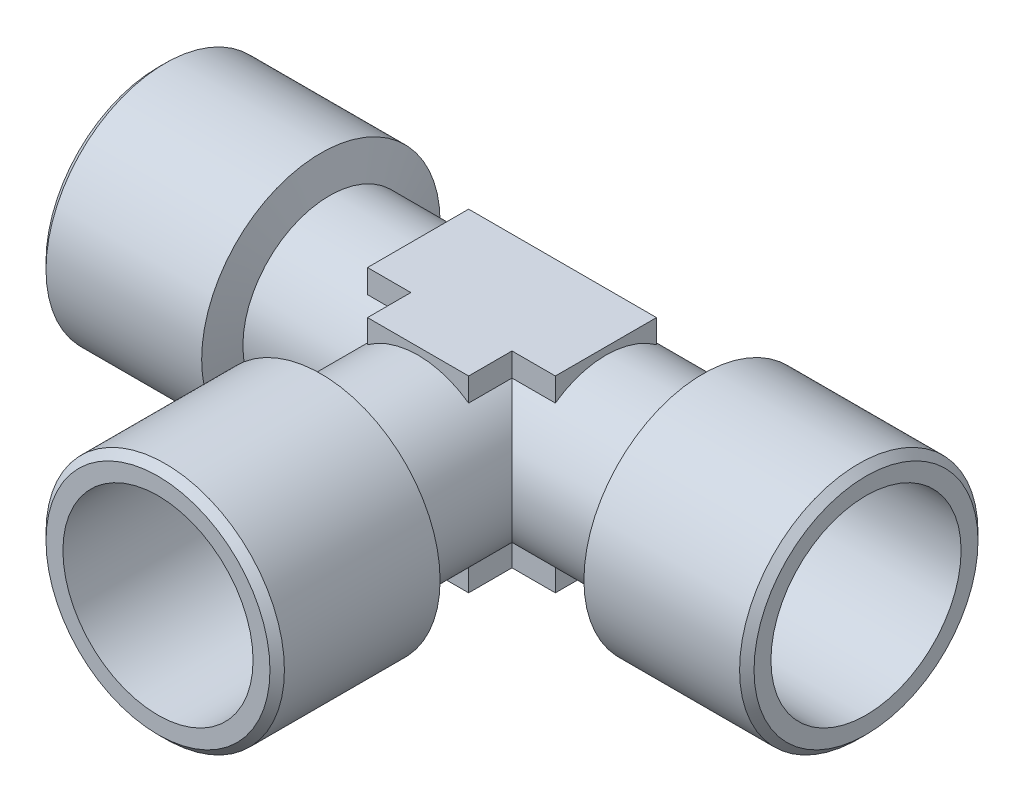
ISO-10303-21;
HEADER;
FILE_DESCRIPTION(('STEP AP214'),'2;1');
FILE_NAME('part.step','',(''),(''),'','','');
FILE_SCHEMA(('AUTOMOTIVE_DESIGN { 1 0 10303 214 1 1 1 1 }'));
ENDSEC;
DATA;
#1=APPLICATION_CONTEXT('core data for automotive mechanical design processes');
#2=APPLICATION_PROTOCOL_DEFINITION('international standard','automotive_design',2000,#1);
#3=PRODUCT_CONTEXT('',#1,'mechanical');
#4=PRODUCT('Part','Part','',(#3));
#5=PRODUCT_RELATED_PRODUCT_CATEGORY('part','',(#4));
#6=PRODUCT_DEFINITION_FORMATION('','',#4);
#7=PRODUCT_DEFINITION_CONTEXT('part definition',#1,'design');
#8=PRODUCT_DEFINITION('design','',#6,#7);
#9=PRODUCT_DEFINITION_SHAPE('','',#8);
#10=(LENGTH_UNIT() NAMED_UNIT(*) SI_UNIT(.MILLI.,.METRE.));
#11=(NAMED_UNIT(*) PLANE_ANGLE_UNIT() SI_UNIT($,.RADIAN.));
#12=(NAMED_UNIT(*) SI_UNIT($,.STERADIAN.) SOLID_ANGLE_UNIT());
#13=UNCERTAINTY_MEASURE_WITH_UNIT(LENGTH_MEASURE(1.E-05),#10,'distance_accuracy_value','');
#14=(GEOMETRIC_REPRESENTATION_CONTEXT(3) GLOBAL_UNCERTAINTY_ASSIGNED_CONTEXT((#13)) GLOBAL_UNIT_ASSIGNED_CONTEXT((#10,
#11,#12)) REPRESENTATION_CONTEXT('',''));
#15=CARTESIAN_POINT('',(0.,0.,0.));
#16=DIRECTION('',(0.,0.,1.));
#17=DIRECTION('',(1.,0.,0.));
#18=AXIS2_PLACEMENT_3D('',#15,#16,#17);
#19=CARTESIAN_POINT('',(0.,0.,0.));
#20=DIRECTION('',(-1.,0.,0.));
#21=DIRECTION('',(0.,0.,1.));
#22=AXIS2_PLACEMENT_3D('',#19,#20,#21);
#23=CYLINDRICAL_SURFACE('',#22,6.);
#24=CARTESIAN_POINT('',(-12.625,0.,0.));
#25=DIRECTION('',(-1.,0.,0.));
#26=DIRECTION('',(0.,0.,1.));
#27=AXIS2_PLACEMENT_3D('',#24,#25,#26);
#28=CIRCLE('',#27,6.);
#29=CARTESIAN_POINT('',(-12.625,0.,6.));
#30=VERTEX_POINT('',#29);
#31=EDGE_CURVE('E255',#30,#30,#28,.T.);
#32=ORIENTED_EDGE('',*,*,#31,.F.);
#33=EDGE_LOOP('',(#32));
#34=FACE_BOUND('',#33,.T.);
#35=CARTESIAN_POINT('',(12.625,0.,0.));
#36=DIRECTION('',(-1.,0.,0.));
#37=DIRECTION('',(0.,0.,1.));
#38=AXIS2_PLACEMENT_3D('',#35,#36,#37);
#39=CIRCLE('',#38,6.);
#40=CARTESIAN_POINT('',(12.625,0.,6.));
#41=VERTEX_POINT('',#40);
#42=EDGE_CURVE('E258',#41,#41,#39,.T.);
#43=ORIENTED_EDGE('',*,*,#42,.T.);
#44=EDGE_LOOP('',(#43));
#45=FACE_BOUND('',#44,.T.);
#46=DIRECTION('',(-1.,0.,0.));
#47=VECTOR('',#46,1.);
#48=CARTESIAN_POINT('',(0.,-4.87339717240448,3.5));
#49=LINE('',#48,#47);
#50=CARTESIAN_POINT('',(-3.5,-4.87339717240448,3.5));
#51=VERTEX_POINT('',#50);
#52=CARTESIAN_POINT('',(-6.5,-4.87339717240448,3.5));
#53=VERTEX_POINT('',#52);
#54=EDGE_CURVE('E241',#51,#53,#49,.T.);
#55=ORIENTED_EDGE('',*,*,#54,.F.);
#56=CARTESIAN_POINT('',(0.,0.,0.));
#57=DIRECTION('',(-0.707106781186547,0.,-0.707106781186547));
#58=DIRECTION('',(-0.707106781186547,0.,0.707106781186547));
#59=AXIS2_PLACEMENT_3D('',#56,#57,#58);
#60=ELLIPSE('',#59,8.48528137423857,6.);
#61=CARTESIAN_POINT('',(-3.5,4.87339717240448,3.5));
#62=VERTEX_POINT('',#61);
#63=EDGE_CURVE('E282',#51,#62,#60,.T.);
#64=ORIENTED_EDGE('',*,*,#63,.T.);
#65=DIRECTION('',(-1.,0.,0.));
#66=VECTOR('',#65,1.);
#67=CARTESIAN_POINT('',(0.,4.87339717240448,3.5));
#68=LINE('',#67,#66);
#69=CARTESIAN_POINT('',(-6.5,4.87339717240448,3.5));
#70=VERTEX_POINT('',#69);
#71=EDGE_CURVE('E239',#70,#62,#68,.F.);
#72=ORIENTED_EDGE('',*,*,#71,.F.);
#73=CARTESIAN_POINT('',(-6.5,0.,0.));
#74=DIRECTION('',(1.,0.,0.));
#75=DIRECTION('',(0.,0.,-1.));
#76=AXIS2_PLACEMENT_3D('',#73,#74,#75);
#77=CIRCLE('',#76,6.);
#78=CARTESIAN_POINT('',(-6.5,4.87339717240448,-3.5));
#79=VERTEX_POINT('',#78);
#80=EDGE_CURVE('E306',#79,#70,#77,.T.);
#81=ORIENTED_EDGE('',*,*,#80,.F.);
#82=DIRECTION('',(-1.,0.,0.));
#83=VECTOR('',#82,1.);
#84=CARTESIAN_POINT('',(0.,4.87339717240448,-3.5));
#85=LINE('',#84,#83);
#86=CARTESIAN_POINT('',(6.5,4.87339717240448,-3.5));
#87=VERTEX_POINT('',#86);
#88=EDGE_CURVE('E303',#87,#79,#85,.T.);
#89=ORIENTED_EDGE('',*,*,#88,.F.);
#90=CARTESIAN_POINT('',(6.5,0.,0.));
#91=DIRECTION('',(-1.,0.,0.));
#92=DIRECTION('',(0.,0.,1.));
#93=AXIS2_PLACEMENT_3D('',#90,#91,#92);
#94=CIRCLE('',#93,6.);
#95=CARTESIAN_POINT('',(6.5,4.87339717240448,3.5));
#96=VERTEX_POINT('',#95);
#97=EDGE_CURVE('E301',#96,#87,#94,.T.);
#98=ORIENTED_EDGE('',*,*,#97,.F.);
#99=DIRECTION('',(-1.,0.,0.));
#100=VECTOR('',#99,1.);
#101=CARTESIAN_POINT('',(0.,4.87339717240448,3.5));
#102=LINE('',#101,#100);
#103=CARTESIAN_POINT('',(3.5,4.87339717240448,3.5));
#104=VERTEX_POINT('',#103);
#105=EDGE_CURVE('E234',#104,#96,#102,.F.);
#106=ORIENTED_EDGE('',*,*,#105,.F.);
#107=CARTESIAN_POINT('',(0.,0.,0.));
#108=DIRECTION('',(-0.707106781186547,0.,0.707106781186547));
#109=DIRECTION('',(-0.707106781186547,0.,-0.707106781186547));
#110=AXIS2_PLACEMENT_3D('',#107,#108,#109);
#111=ELLIPSE('',#110,8.48528137423857,6.);
#112=CARTESIAN_POINT('',(3.5,-4.87339717240448,3.5));
#113=VERTEX_POINT('',#112);
#114=EDGE_CURVE('E279',#104,#113,#111,.F.);
#115=ORIENTED_EDGE('',*,*,#114,.T.);
#116=DIRECTION('',(-1.,0.,0.));
#117=VECTOR('',#116,1.);
#118=CARTESIAN_POINT('',(0.,-4.87339717240448,3.5));
#119=LINE('',#118,#117);
#120=CARTESIAN_POINT('',(6.5,-4.87339717240448,3.5));
#121=VERTEX_POINT('',#120);
#122=EDGE_CURVE('E236',#121,#113,#119,.T.);
#123=ORIENTED_EDGE('',*,*,#122,.F.);
#124=CARTESIAN_POINT('',(6.5,-4.87339717240448,-3.5));
#125=VERTEX_POINT('',#124);
#126=EDGE_CURVE('E304',#125,#121,#94,.T.);
#127=ORIENTED_EDGE('',*,*,#126,.F.);
#128=DIRECTION('',(-1.,0.,0.));
#129=VECTOR('',#128,1.);
#130=CARTESIAN_POINT('',(0.,-4.87339717240448,-3.5));
#131=LINE('',#130,#129);
#132=CARTESIAN_POINT('',(-6.5,-4.87339717240448,-3.5));
#133=VERTEX_POINT('',#132);
#134=EDGE_CURVE('E308',#133,#125,#131,.F.);
#135=ORIENTED_EDGE('',*,*,#134,.F.);
#136=EDGE_CURVE('E134',#53,#133,#77,.T.);
#137=ORIENTED_EDGE('',*,*,#136,.F.);
#138=EDGE_LOOP('',(#55,#64,#72,#81,#89,#98,#106,#115,#123,#127,#135,#137));
#139=FACE_BOUND('',#138,.T.);
#140=ADVANCED_FACE('F16',(#34,#45,#139),#23,.T.);
#141=CARTESIAN_POINT('',(0.,0.,0.));
#142=DIRECTION('',(0.,0.,-1.));
#143=DIRECTION('',(-1.,0.,0.));
#144=AXIS2_PLACEMENT_3D('',#141,#142,#143);
#145=CYLINDRICAL_SURFACE('',#144,6.);
#146=CARTESIAN_POINT('',(0.,0.,12.625));
#147=DIRECTION('',(0.,0.,-1.));
#148=DIRECTION('',(-1.,0.,0.));
#149=AXIS2_PLACEMENT_3D('',#146,#147,#148);
#150=CIRCLE('',#149,6.);
#151=CARTESIAN_POINT('',(-6.,0.,12.625));
#152=VERTEX_POINT('',#151);
#153=EDGE_CURVE('E252',#152,#152,#150,.T.);
#154=ORIENTED_EDGE('',*,*,#153,.T.);
#155=EDGE_LOOP('',(#154));
#156=FACE_BOUND('',#155,.T.);
#157=CARTESIAN_POINT('',(0.,0.,6.5));
#158=DIRECTION('',(0.,0.,-1.));
#159=DIRECTION('',(-1.,0.,0.));
#160=AXIS2_PLACEMENT_3D('',#157,#158,#159);
#161=CIRCLE('',#160,6.);
#162=CARTESIAN_POINT('',(3.5,4.87339717240448,6.5));
#163=VERTEX_POINT('',#162);
#164=CARTESIAN_POINT('',(-3.5,4.87339717240448,6.5));
#165=VERTEX_POINT('',#164);
#166=EDGE_CURVE('E292',#163,#165,#161,.F.);
#167=ORIENTED_EDGE('',*,*,#166,.T.);
#168=DIRECTION('',(0.,0.,-1.));
#169=VECTOR('',#168,1.);
#170=CARTESIAN_POINT('',(-3.5,4.87339717240448,0.));
#171=LINE('',#170,#169);
#172=EDGE_CURVE('E298',#165,#62,#171,.T.);
#173=ORIENTED_EDGE('',*,*,#172,.T.);
#174=ORIENTED_EDGE('',*,*,#63,.F.);
#175=DIRECTION('',(0.,0.,-1.));
#176=VECTOR('',#175,1.);
#177=CARTESIAN_POINT('',(-3.5,-4.87339717240448,0.));
#178=LINE('',#177,#176);
#179=CARTESIAN_POINT('',(-3.5,-4.87339717240448,6.5));
#180=VERTEX_POINT('',#179);
#181=EDGE_CURVE('E291',#51,#180,#178,.F.);
#182=ORIENTED_EDGE('',*,*,#181,.T.);
#183=CARTESIAN_POINT('',(3.5,-4.87339717240448,6.5));
#184=VERTEX_POINT('',#183);
#185=EDGE_CURVE('E288',#180,#184,#161,.F.);
#186=ORIENTED_EDGE('',*,*,#185,.T.);
#187=DIRECTION('',(0.,0.,-1.));
#188=VECTOR('',#187,1.);
#189=CARTESIAN_POINT('',(3.5,-4.87339717240448,0.));
#190=LINE('',#189,#188);
#191=EDGE_CURVE('E285',#184,#113,#190,.T.);
#192=ORIENTED_EDGE('',*,*,#191,.T.);
#193=ORIENTED_EDGE('',*,*,#114,.F.);
#194=DIRECTION('',(0.,0.,-1.));
#195=VECTOR('',#194,1.);
#196=CARTESIAN_POINT('',(3.5,4.87339717240448,0.));
#197=LINE('',#196,#195);
#198=EDGE_CURVE('E295',#104,#163,#197,.F.);
#199=ORIENTED_EDGE('',*,*,#198,.T.);
#200=EDGE_LOOP('',(#167,#173,#174,#182,#186,#192,#193,#199));
#201=FACE_BOUND('',#200,.T.);
#202=ADVANCED_FACE('F329',(#156,#201),#145,.T.);
#203=CARTESIAN_POINT('',(-12.625,0.,0.));
#204=DIRECTION('',(-1.,0.,0.));
#205=DIRECTION('',(0.,0.,1.));
#206=AXIS2_PLACEMENT_3D('',#203,#204,#205);
#207=CONICAL_SURFACE('',#206,6.,1.30899693899575);
#208=CARTESIAN_POINT('',(-13.22788568297,0.,0.));
#209=DIRECTION('',(-1.,0.,0.));
#210=DIRECTION('',(0.,0.,1.));
#211=AXIS2_PLACEMENT_3D('',#208,#209,#210);
#212=CIRCLE('',#211,8.25);
#213=CARTESIAN_POINT('',(-13.22788568297,0.,8.25));
#214=VERTEX_POINT('',#213);
#215=EDGE_CURVE('E276',#214,#214,#212,.T.);
#216=ORIENTED_EDGE('',*,*,#215,.F.);
#217=EDGE_LOOP('',(#216));
#218=FACE_BOUND('',#217,.T.);
#219=ORIENTED_EDGE('',*,*,#31,.T.);
#220=EDGE_LOOP('',(#219));
#221=FACE_BOUND('',#220,.T.);
#222=ADVANCED_FACE('F18',(#218,#221),#207,.T.);
#223=CARTESIAN_POINT('',(0.,0.,0.));
#224=DIRECTION('',(-1.,0.,0.));
#225=DIRECTION('',(0.,0.,1.));
#226=AXIS2_PLACEMENT_3D('',#223,#224,#225);
#227=CYLINDRICAL_SURFACE('',#226,8.25);
#228=CARTESIAN_POINT('',(-24.,0.,0.));
#229=DIRECTION('',(-1.,0.,0.));
#230=DIRECTION('',(0.,0.,1.));
#231=AXIS2_PLACEMENT_3D('',#228,#229,#230);
#232=CIRCLE('',#231,8.25);
#233=CARTESIAN_POINT('',(-24.,0.,8.25));
#234=VERTEX_POINT('',#233);
#235=EDGE_CURVE('E273',#234,#234,#232,.T.);
#236=ORIENTED_EDGE('',*,*,#235,.F.);
#237=EDGE_LOOP('',(#236));
#238=FACE_BOUND('',#237,.T.);
#239=ORIENTED_EDGE('',*,*,#215,.T.);
#240=EDGE_LOOP('',(#239));
#241=FACE_BOUND('',#240,.T.);
#242=ADVANCED_FACE('F432',(#238,#241),#227,.T.);
#243=CARTESIAN_POINT('',(-24.,0.,0.));
#244=DIRECTION('',(1.,0.,0.));
#245=DIRECTION('',(0.,0.,-1.));
#246=AXIS2_PLACEMENT_3D('',#243,#244,#245);
#247=CONICAL_SURFACE('',#246,8.25,0.785398163397445);
#248=CARTESIAN_POINT('',(-24.5,0.,0.));
#249=DIRECTION('',(-1.,0.,0.));
#250=DIRECTION('',(0.,0.,1.));
#251=AXIS2_PLACEMENT_3D('',#248,#249,#250);
#252=CIRCLE('',#251,7.75);
#253=CARTESIAN_POINT('',(-24.5,0.,7.75));
#254=VERTEX_POINT('',#253);
#255=EDGE_CURVE('E270',#254,#254,#252,.T.);
#256=ORIENTED_EDGE('',*,*,#255,.F.);
#257=EDGE_LOOP('',(#256));
#258=FACE_BOUND('',#257,.T.);
#259=ORIENTED_EDGE('',*,*,#235,.T.);
#260=EDGE_LOOP('',(#259));
#261=FACE_BOUND('',#260,.T.);
#262=ADVANCED_FACE('F429',(#258,#261),#247,.T.);
#263=CARTESIAN_POINT('',(-24.5,0.,-7.75));
#264=DIRECTION('',(1.,0.,0.));
#265=DIRECTION('',(0.,0.,-1.));
#266=AXIS2_PLACEMENT_3D('',#263,#264,#265);
#267=PLANE('',#266);
#268=CARTESIAN_POINT('',(-24.5,0.,0.));
#269=DIRECTION('',(-1.,0.,0.));
#270=DIRECTION('',(0.,0.,1.));
#271=AXIS2_PLACEMENT_3D('',#268,#269,#270);
#272=CIRCLE('',#271,6.58);
#273=CARTESIAN_POINT('',(-24.5,0.,6.58));
#274=VERTEX_POINT('',#273);
#275=EDGE_CURVE('E160',#274,#274,#272,.T.);
#276=ORIENTED_EDGE('',*,*,#275,.F.);
#277=EDGE_LOOP('',(#276));
#278=FACE_BOUND('',#277,.T.);
#279=ORIENTED_EDGE('',*,*,#255,.T.);
#280=EDGE_LOOP('',(#279));
#281=FACE_BOUND('',#280,.T.);
#282=ADVANCED_FACE('F425',(#278,#281),#267,.F.);
#283=CARTESIAN_POINT('',(24.5,0.,-7.75));
#284=DIRECTION('',(-1.,0.,0.));
#285=DIRECTION('',(0.,0.,1.));
#286=AXIS2_PLACEMENT_3D('',#283,#284,#285);
#287=PLANE('',#286);
#288=CARTESIAN_POINT('',(24.5,0.,0.));
#289=DIRECTION('',(-1.,0.,0.));
#290=DIRECTION('',(0.,0.,1.));
#291=AXIS2_PLACEMENT_3D('',#288,#289,#290);
#292=CIRCLE('',#291,6.58);
#293=CARTESIAN_POINT('',(24.5,0.,6.58));
#294=VERTEX_POINT('',#293);
#295=EDGE_CURVE('E154',#294,#294,#292,.T.);
#296=ORIENTED_EDGE('',*,*,#295,.T.);
#297=EDGE_LOOP('',(#296));
#298=FACE_BOUND('',#297,.T.);
#299=CARTESIAN_POINT('',(24.5,0.,0.));
#300=DIRECTION('',(-1.,0.,0.));
#301=DIRECTION('',(0.,0.,1.));
#302=AXIS2_PLACEMENT_3D('',#299,#300,#301);
#303=CIRCLE('',#302,7.75);
#304=CARTESIAN_POINT('',(24.5,0.,7.75));
#305=VERTEX_POINT('',#304);
#306=EDGE_CURVE('E267',#305,#305,#303,.T.);
#307=ORIENTED_EDGE('',*,*,#306,.F.);
#308=EDGE_LOOP('',(#307));
#309=FACE_BOUND('',#308,.T.);
#310=ADVANCED_FACE('F421',(#298,#309),#287,.F.);
#311=CARTESIAN_POINT('',(24.5,0.,0.));
#312=DIRECTION('',(-1.,0.,0.));
#313=DIRECTION('',(0.,0.,1.));
#314=AXIS2_PLACEMENT_3D('',#311,#312,#313);
#315=CONICAL_SURFACE('',#314,7.75,0.785398163397446);
#316=CARTESIAN_POINT('',(24.,0.,0.));
#317=DIRECTION('',(-1.,0.,0.));
#318=DIRECTION('',(0.,0.,1.));
#319=AXIS2_PLACEMENT_3D('',#316,#317,#318);
#320=CIRCLE('',#319,8.25);
#321=CARTESIAN_POINT('',(24.,0.,8.25));
#322=VERTEX_POINT('',#321);
#323=EDGE_CURVE('E264',#322,#322,#320,.T.);
#324=ORIENTED_EDGE('',*,*,#323,.F.);
#325=EDGE_LOOP('',(#324));
#326=FACE_BOUND('',#325,.T.);
#327=ORIENTED_EDGE('',*,*,#306,.T.);
#328=EDGE_LOOP('',(#327));
#329=FACE_BOUND('',#328,.T.);
#330=ADVANCED_FACE('F417',(#326,#329),#315,.T.);
#331=CARTESIAN_POINT('',(0.,0.,0.));
#332=DIRECTION('',(-1.,0.,0.));
#333=DIRECTION('',(0.,0.,1.));
#334=AXIS2_PLACEMENT_3D('',#331,#332,#333);
#335=CYLINDRICAL_SURFACE('',#334,8.25);
#336=CARTESIAN_POINT('',(13.22788568297,0.,0.));
#337=DIRECTION('',(-1.,0.,0.));
#338=DIRECTION('',(0.,0.,1.));
#339=AXIS2_PLACEMENT_3D('',#336,#337,#338);
#340=CIRCLE('',#339,8.25);
#341=CARTESIAN_POINT('',(13.22788568297,0.,8.25));
#342=VERTEX_POINT('',#341);
#343=EDGE_CURVE('E261',#342,#342,#340,.T.);
#344=ORIENTED_EDGE('',*,*,#343,.F.);
#345=EDGE_LOOP('',(#344));
#346=FACE_BOUND('',#345,.T.);
#347=ORIENTED_EDGE('',*,*,#323,.T.);
#348=EDGE_LOOP('',(#347));
#349=FACE_BOUND('',#348,.T.);
#350=ADVANCED_FACE('F413',(#346,#349),#335,.T.);
#351=CARTESIAN_POINT('',(13.22788568297,0.,0.));
#352=DIRECTION('',(1.,0.,0.));
#353=DIRECTION('',(0.,0.,-1.));
#354=AXIS2_PLACEMENT_3D('',#351,#352,#353);
#355=CONICAL_SURFACE('',#354,8.25,1.30899693899575);
#356=ORIENTED_EDGE('',*,*,#42,.F.);
#357=EDGE_LOOP('',(#356));
#358=FACE_BOUND('',#357,.T.);
#359=ORIENTED_EDGE('',*,*,#343,.T.);
#360=EDGE_LOOP('',(#359));
#361=FACE_BOUND('',#360,.T.);
#362=ADVANCED_FACE('F409',(#358,#361),#355,.T.);
#363=CARTESIAN_POINT('',(0.,0.,12.625));
#364=DIRECTION('',(0.,0.,1.));
#365=DIRECTION('',(1.,0.,0.));
#366=AXIS2_PLACEMENT_3D('',#363,#364,#365);
#367=CONICAL_SURFACE('',#366,6.,1.30899693899575);
#368=CARTESIAN_POINT('',(0.,0.,13.22788568297));
#369=DIRECTION('',(0.,0.,-1.));
#370=DIRECTION('',(-1.,0.,0.));
#371=AXIS2_PLACEMENT_3D('',#368,#369,#370);
#372=CIRCLE('',#371,8.25);
#373=CARTESIAN_POINT('',(-8.25,0.,13.22788568297));
#374=VERTEX_POINT('',#373);
#375=EDGE_CURVE('E249',#374,#374,#372,.T.);
#376=ORIENTED_EDGE('',*,*,#375,.T.);
#377=EDGE_LOOP('',(#376));
#378=FACE_BOUND('',#377,.T.);
#379=ORIENTED_EDGE('',*,*,#153,.F.);
#380=EDGE_LOOP('',(#379));
#381=FACE_BOUND('',#380,.T.);
#382=ADVANCED_FACE('F412',(#378,#381),#367,.T.);
#383=CARTESIAN_POINT('',(0.,0.,0.));
#384=DIRECTION('',(0.,0.,-1.));
#385=DIRECTION('',(-1.,0.,0.));
#386=AXIS2_PLACEMENT_3D('',#383,#384,#385);
#387=CYLINDRICAL_SURFACE('',#386,8.25);
#388=CARTESIAN_POINT('',(0.,0.,24.));
#389=DIRECTION('',(0.,0.,-1.));
#390=DIRECTION('',(-1.,0.,0.));
#391=AXIS2_PLACEMENT_3D('',#388,#389,#390);
#392=CIRCLE('',#391,8.25);
#393=CARTESIAN_POINT('',(-8.25,0.,24.));
#394=VERTEX_POINT('',#393);
#395=EDGE_CURVE('E246',#394,#394,#392,.T.);
#396=ORIENTED_EDGE('',*,*,#395,.T.);
#397=EDGE_LOOP('',(#396));
#398=FACE_BOUND('',#397,.T.);
#399=ORIENTED_EDGE('',*,*,#375,.F.);
#400=EDGE_LOOP('',(#399));
#401=FACE_BOUND('',#400,.T.);
#402=ADVANCED_FACE('F670',(#398,#401),#387,.T.);
#403=CARTESIAN_POINT('',(0.,0.,24.));
#404=DIRECTION('',(0.,0.,-1.));
#405=DIRECTION('',(-1.,0.,0.));
#406=AXIS2_PLACEMENT_3D('',#403,#404,#405);
#407=CONICAL_SURFACE('',#406,8.25,0.785398163397447);
#408=CARTESIAN_POINT('',(0.,0.,24.5));
#409=DIRECTION('',(0.,0.,-1.));
#410=DIRECTION('',(-1.,0.,0.));
#411=AXIS2_PLACEMENT_3D('',#408,#409,#410);
#412=CIRCLE('',#411,7.75);
#413=CARTESIAN_POINT('',(-7.75,0.,24.5));
#414=VERTEX_POINT('',#413);
#415=EDGE_CURVE('E243',#414,#414,#412,.T.);
#416=ORIENTED_EDGE('',*,*,#415,.T.);
#417=EDGE_LOOP('',(#416));
#418=FACE_BOUND('',#417,.T.);
#419=ORIENTED_EDGE('',*,*,#395,.F.);
#420=EDGE_LOOP('',(#419));
#421=FACE_BOUND('',#420,.T.);
#422=ADVANCED_FACE('F661',(#418,#421),#407,.T.);
#423=CARTESIAN_POINT('',(-7.75,0.,24.5));
#424=DIRECTION('',(0.,0.,1.));
#425=DIRECTION('',(1.,0.,0.));
#426=AXIS2_PLACEMENT_3D('',#423,#424,#425);
#427=PLANE('',#426);
#428=CARTESIAN_POINT('',(0.,0.,24.5));
#429=DIRECTION('',(0.,0.,-1.));
#430=DIRECTION('',(-1.,0.,0.));
#431=AXIS2_PLACEMENT_3D('',#428,#429,#430);
#432=CIRCLE('',#431,6.58);
#433=CARTESIAN_POINT('',(-6.58,0.,24.5));
#434=VERTEX_POINT('',#433);
#435=EDGE_CURVE('E746',#434,#434,#432,.T.);
#436=ORIENTED_EDGE('',*,*,#435,.T.);
#437=EDGE_LOOP('',(#436));
#438=FACE_BOUND('',#437,.T.);
#439=ORIENTED_EDGE('',*,*,#415,.F.);
#440=EDGE_LOOP('',(#439));
#441=FACE_BOUND('',#440,.T.);
#442=ADVANCED_FACE('F560',(#438,#441),#427,.T.);
#443=CARTESIAN_POINT('',(6.5,-6.5,3.5));
#444=DIRECTION('',(0.,-1.,0.));
#445=DIRECTION('',(0.,0.,-1.));
#446=AXIS2_PLACEMENT_3D('',#443,#444,#445);
#447=PLANE('',#446);
#448=DIRECTION('',(0.,0.,-1.));
#449=VECTOR('',#448,1.);
#450=CARTESIAN_POINT('',(6.5,-6.5,3.5));
#451=LINE('',#450,#449);
#452=CARTESIAN_POINT('',(6.5,-6.5,3.5));
#453=VERTEX_POINT('',#452);
#454=CARTESIAN_POINT('',(6.5,-6.5,-3.5));
#455=VERTEX_POINT('',#454);
#456=EDGE_CURVE('E163',#453,#455,#451,.T.);
#457=ORIENTED_EDGE('',*,*,#456,.F.);
#458=DIRECTION('',(1.,0.,0.));
#459=VECTOR('',#458,1.);
#460=CARTESIAN_POINT('',(3.5,-6.5,3.5));
#461=LINE('',#460,#459);
#462=CARTESIAN_POINT('',(3.5,-6.5,3.5));
#463=VERTEX_POINT('',#462);
#464=EDGE_CURVE('E168',#463,#453,#461,.T.);
#465=ORIENTED_EDGE('',*,*,#464,.F.);
#466=DIRECTION('',(0.,0.,-1.));
#467=VECTOR('',#466,1.);
#468=CARTESIAN_POINT('',(3.5,-6.5,6.5));
#469=LINE('',#468,#467);
#470=CARTESIAN_POINT('',(3.5,-6.5,6.5));
#471=VERTEX_POINT('',#470);
#472=EDGE_CURVE('E200',#471,#463,#469,.T.);
#473=ORIENTED_EDGE('',*,*,#472,.F.);
#474=DIRECTION('',(1.,0.,0.));
#475=VECTOR('',#474,1.);
#476=CARTESIAN_POINT('',(-3.5,-6.5,6.5));
#477=LINE('',#476,#475);
#478=CARTESIAN_POINT('',(-3.5,-6.5,6.5));
#479=VERTEX_POINT('',#478);
#480=EDGE_CURVE('E197',#479,#471,#477,.T.);
#481=ORIENTED_EDGE('',*,*,#480,.F.);
#482=DIRECTION('',(0.,0.,1.));
#483=VECTOR('',#482,1.);
#484=CARTESIAN_POINT('',(-3.5,-6.5,3.5));
#485=LINE('',#484,#483);
#486=CARTESIAN_POINT('',(-3.5,-6.5,3.5));
#487=VERTEX_POINT('',#486);
#488=EDGE_CURVE('E194',#487,#479,#485,.T.);
#489=ORIENTED_EDGE('',*,*,#488,.F.);
#490=DIRECTION('',(1.,0.,0.));
#491=VECTOR('',#490,1.);
#492=CARTESIAN_POINT('',(-6.5,-6.5,3.5));
#493=LINE('',#492,#491);
#494=CARTESIAN_POINT('',(-6.5,-6.5,3.5));
#495=VERTEX_POINT('',#494);
#496=EDGE_CURVE('E191',#495,#487,#493,.T.);
#497=ORIENTED_EDGE('',*,*,#496,.F.);
#498=DIRECTION('',(0.,0.,1.));
#499=VECTOR('',#498,1.);
#500=CARTESIAN_POINT('',(-6.5,-6.5,-3.5));
#501=LINE('',#500,#499);
#502=CARTESIAN_POINT('',(-6.5,-6.5,-3.5));
#503=VERTEX_POINT('',#502);
#504=EDGE_CURVE('E188',#503,#495,#501,.T.);
#505=ORIENTED_EDGE('',*,*,#504,.F.);
#506=DIRECTION('',(-1.,0.,0.));
#507=VECTOR('',#506,1.);
#508=CARTESIAN_POINT('',(6.5,-6.5,-3.5));
#509=LINE('',#508,#507);
#510=EDGE_CURVE('E185',#455,#503,#509,.T.);
#511=ORIENTED_EDGE('',*,*,#510,.F.);
#512=EDGE_LOOP('',(#457,#465,#473,#481,#489,#497,#505,#511));
#513=FACE_BOUND('',#512,.T.);
#514=ADVANCED_FACE('F340',(#513),#447,.T.);
#515=CARTESIAN_POINT('',(3.5,6.5,6.5));
#516=DIRECTION('',(-1.,0.,0.));
#517=DIRECTION('',(0.,0.,1.));
#518=AXIS2_PLACEMENT_3D('',#515,#516,#517);
#519=PLANE('',#518);
#520=ORIENTED_EDGE('',*,*,#191,.F.);
#521=DIRECTION('',(0.,-1.,0.));
#522=VECTOR('',#521,1.);
#523=CARTESIAN_POINT('',(3.5,6.5,6.5));
#524=LINE('',#523,#522);
#525=EDGE_CURVE('E212',#184,#471,#524,.T.);
#526=ORIENTED_EDGE('',*,*,#525,.T.);
#527=ORIENTED_EDGE('',*,*,#472,.T.);
#528=DIRECTION('',(0.,-1.,0.));
#529=VECTOR('',#528,1.);
#530=CARTESIAN_POINT('',(3.5,6.5,3.5));
#531=LINE('',#530,#529);
#532=EDGE_CURVE('E208',#113,#463,#531,.T.);
#533=ORIENTED_EDGE('',*,*,#532,.F.);
#534=EDGE_LOOP('',(#520,#526,#527,#533));
#535=FACE_BOUND('',#534,.T.);
#536=ADVANCED_FACE('F332',(#535),#519,.F.);
#537=CARTESIAN_POINT('',(-3.5,6.5,6.5));
#538=DIRECTION('',(0.,0.,-1.));
#539=DIRECTION('',(-1.,0.,0.));
#540=AXIS2_PLACEMENT_3D('',#537,#538,#539);
#541=PLANE('',#540);
#542=ORIENTED_EDGE('',*,*,#185,.F.);
#543=DIRECTION('',(0.,-1.,0.));
#544=VECTOR('',#543,1.);
#545=CARTESIAN_POINT('',(-3.5,6.5,6.5));
#546=LINE('',#545,#544);
#547=EDGE_CURVE('E214',#180,#479,#546,.T.);
#548=ORIENTED_EDGE('',*,*,#547,.T.);
#549=ORIENTED_EDGE('',*,*,#480,.T.);
#550=ORIENTED_EDGE('',*,*,#525,.F.);
#551=EDGE_LOOP('',(#542,#548,#549,#550));
#552=FACE_BOUND('',#551,.T.);
#553=ADVANCED_FACE('F334',(#552),#541,.F.);
#554=CARTESIAN_POINT('',(-3.5,6.5,3.5));
#555=DIRECTION('',(1.,0.,0.));
#556=DIRECTION('',(0.,0.,-1.));
#557=AXIS2_PLACEMENT_3D('',#554,#555,#556);
#558=PLANE('',#557);
#559=ORIENTED_EDGE('',*,*,#181,.F.);
#560=DIRECTION('',(0.,-1.,0.));
#561=VECTOR('',#560,1.);
#562=CARTESIAN_POINT('',(-3.5,6.5,3.5));
#563=LINE('',#562,#561);
#564=EDGE_CURVE('E218',#51,#487,#563,.T.);
#565=ORIENTED_EDGE('',*,*,#564,.T.);
#566=ORIENTED_EDGE('',*,*,#488,.T.);
#567=ORIENTED_EDGE('',*,*,#547,.F.);
#568=EDGE_LOOP('',(#559,#565,#566,#567));
#569=FACE_BOUND('',#568,.T.);
#570=ADVANCED_FACE('F354',(#569),#558,.F.);
#571=CARTESIAN_POINT('',(3.5,6.5,3.5));
#572=DIRECTION('',(0.,0.,-1.));
#573=DIRECTION('',(-1.,0.,0.));
#574=AXIS2_PLACEMENT_3D('',#571,#572,#573);
#575=PLANE('',#574);
#576=DIRECTION('',(0.,-1.,0.));
#577=VECTOR('',#576,1.);
#578=CARTESIAN_POINT('',(6.5,6.5,3.5));
#579=LINE('',#578,#577);
#580=EDGE_CURVE('E182',#121,#453,#579,.T.);
#581=ORIENTED_EDGE('',*,*,#580,.F.);
#582=ORIENTED_EDGE('',*,*,#122,.T.);
#583=ORIENTED_EDGE('',*,*,#532,.T.);
#584=ORIENTED_EDGE('',*,*,#464,.T.);
#585=EDGE_LOOP('',(#581,#582,#583,#584));
#586=FACE_BOUND('',#585,.T.);
#587=ADVANCED_FACE('F320',(#586),#575,.F.);
#588=CARTESIAN_POINT('',(-6.5,6.5,3.5));
#589=DIRECTION('',(0.,0.,-1.));
#590=DIRECTION('',(-1.,0.,0.));
#591=AXIS2_PLACEMENT_3D('',#588,#589,#590);
#592=PLANE('',#591);
#593=ORIENTED_EDGE('',*,*,#564,.F.);
#594=ORIENTED_EDGE('',*,*,#54,.T.);
#595=DIRECTION('',(0.,-1.,0.));
#596=VECTOR('',#595,1.);
#597=CARTESIAN_POINT('',(-6.5,6.5,3.5));
#598=LINE('',#597,#596);
#599=EDGE_CURVE('E222',#53,#495,#598,.T.);
#600=ORIENTED_EDGE('',*,*,#599,.T.);
#601=ORIENTED_EDGE('',*,*,#496,.T.);
#602=EDGE_LOOP('',(#593,#594,#600,#601));
#603=FACE_BOUND('',#602,.T.);
#604=ADVANCED_FACE('F352',(#603),#592,.F.);
#605=CARTESIAN_POINT('',(-6.5,6.5,-3.5));
#606=DIRECTION('',(1.,0.,0.));
#607=DIRECTION('',(0.,0.,-1.));
#608=AXIS2_PLACEMENT_3D('',#605,#606,#607);
#609=PLANE('',#608);
#610=ORIENTED_EDGE('',*,*,#599,.F.);
#611=ORIENTED_EDGE('',*,*,#136,.T.);
#612=DIRECTION('',(0.,-1.,0.));
#613=VECTOR('',#612,1.);
#614=CARTESIAN_POINT('',(-6.5,6.5,-3.5));
#615=LINE('',#614,#613);
#616=EDGE_CURVE('E226',#133,#503,#615,.T.);
#617=ORIENTED_EDGE('',*,*,#616,.T.);
#618=ORIENTED_EDGE('',*,*,#504,.T.);
#619=EDGE_LOOP('',(#610,#611,#617,#618));
#620=FACE_BOUND('',#619,.T.);
#621=ADVANCED_FACE('F349',(#620),#609,.F.);
#622=CARTESIAN_POINT('',(6.5,6.5,-3.5));
#623=DIRECTION('',(0.,0.,1.));
#624=DIRECTION('',(1.,0.,0.));
#625=AXIS2_PLACEMENT_3D('',#622,#623,#624);
#626=PLANE('',#625);
#627=ORIENTED_EDGE('',*,*,#616,.F.);
#628=ORIENTED_EDGE('',*,*,#134,.T.);
#629=DIRECTION('',(0.,-1.,0.));
#630=VECTOR('',#629,1.);
#631=CARTESIAN_POINT('',(6.5,6.5,-3.5));
#632=LINE('',#631,#630);
#633=EDGE_CURVE('E230',#125,#455,#632,.T.);
#634=ORIENTED_EDGE('',*,*,#633,.T.);
#635=ORIENTED_EDGE('',*,*,#510,.T.);
#636=EDGE_LOOP('',(#627,#628,#634,#635));
#637=FACE_BOUND('',#636,.T.);
#638=ADVANCED_FACE('F344',(#637),#626,.F.);
#639=CARTESIAN_POINT('',(6.5,6.5,3.5));
#640=DIRECTION('',(-1.,0.,0.));
#641=DIRECTION('',(0.,0.,1.));
#642=AXIS2_PLACEMENT_3D('',#639,#640,#641);
#643=PLANE('',#642);
#644=ORIENTED_EDGE('',*,*,#633,.F.);
#645=ORIENTED_EDGE('',*,*,#126,.T.);
#646=ORIENTED_EDGE('',*,*,#580,.T.);
#647=ORIENTED_EDGE('',*,*,#456,.T.);
#648=EDGE_LOOP('',(#644,#645,#646,#647));
#649=FACE_BOUND('',#648,.T.);
#650=ADVANCED_FACE('F316',(#649),#643,.F.);
#651=CARTESIAN_POINT('',(6.5,6.5,3.5));
#652=VERTEX_POINT('',#651);
#653=EDGE_CURVE('E205',#652,#96,#579,.T.);
#654=ORIENTED_EDGE('',*,*,#653,.T.);
#655=ORIENTED_EDGE('',*,*,#97,.T.);
#656=CARTESIAN_POINT('',(6.5,6.5,-3.5));
#657=VERTEX_POINT('',#656);
#658=EDGE_CURVE('E231',#657,#87,#632,.T.);
#659=ORIENTED_EDGE('',*,*,#658,.F.);
#660=DIRECTION('',(0.,0.,-1.));
#661=VECTOR('',#660,1.);
#662=CARTESIAN_POINT('',(6.5,6.5,3.5));
#663=LINE('',#662,#661);
#664=EDGE_CURVE('E164',#652,#657,#663,.T.);
#665=ORIENTED_EDGE('',*,*,#664,.F.);
#666=EDGE_LOOP('',(#654,#655,#659,#665));
#667=FACE_BOUND('',#666,.T.);
#668=ADVANCED_FACE('F378',(#667),#643,.F.);
#669=ORIENTED_EDGE('',*,*,#658,.T.);
#670=ORIENTED_EDGE('',*,*,#88,.T.);
#671=CARTESIAN_POINT('',(-6.5,6.5,-3.5));
#672=VERTEX_POINT('',#671);
#673=EDGE_CURVE('E227',#672,#79,#615,.T.);
#674=ORIENTED_EDGE('',*,*,#673,.F.);
#675=DIRECTION('',(-1.,0.,0.));
#676=VECTOR('',#675,1.);
#677=CARTESIAN_POINT('',(6.5,6.5,-3.5));
#678=LINE('',#677,#676);
#679=EDGE_CURVE('E167',#657,#672,#678,.T.);
#680=ORIENTED_EDGE('',*,*,#679,.F.);
#681=EDGE_LOOP('',(#669,#670,#674,#680));
#682=FACE_BOUND('',#681,.T.);
#683=ADVANCED_FACE('F375',(#682),#626,.F.);
#684=ORIENTED_EDGE('',*,*,#673,.T.);
#685=ORIENTED_EDGE('',*,*,#80,.T.);
#686=CARTESIAN_POINT('',(-6.5,6.5,3.5));
#687=VERTEX_POINT('',#686);
#688=EDGE_CURVE('E223',#687,#70,#598,.T.);
#689=ORIENTED_EDGE('',*,*,#688,.F.);
#690=DIRECTION('',(0.,0.,1.));
#691=VECTOR('',#690,1.);
#692=CARTESIAN_POINT('',(-6.5,6.5,-3.5));
#693=LINE('',#692,#691);
#694=EDGE_CURVE('E170',#672,#687,#693,.T.);
#695=ORIENTED_EDGE('',*,*,#694,.F.);
#696=EDGE_LOOP('',(#684,#685,#689,#695));
#697=FACE_BOUND('',#696,.T.);
#698=ADVANCED_FACE('F373',(#697),#609,.F.);
#699=ORIENTED_EDGE('',*,*,#688,.T.);
#700=ORIENTED_EDGE('',*,*,#71,.T.);
#701=CARTESIAN_POINT('',(-3.5,6.5,3.5));
#702=VERTEX_POINT('',#701);
#703=EDGE_CURVE('E219',#702,#62,#563,.T.);
#704=ORIENTED_EDGE('',*,*,#703,.F.);
#705=DIRECTION('',(1.,0.,0.));
#706=VECTOR('',#705,1.);
#707=CARTESIAN_POINT('',(-6.5,6.5,3.5));
#708=LINE('',#707,#706);
#709=EDGE_CURVE('E172',#687,#702,#708,.T.);
#710=ORIENTED_EDGE('',*,*,#709,.F.);
#711=EDGE_LOOP('',(#699,#700,#704,#710));
#712=FACE_BOUND('',#711,.T.);
#713=ADVANCED_FACE('F360',(#712),#592,.F.);
#714=ORIENTED_EDGE('',*,*,#198,.F.);
#715=CARTESIAN_POINT('',(3.5,6.5,3.5));
#716=VERTEX_POINT('',#715);
#717=EDGE_CURVE('E209',#716,#104,#531,.T.);
#718=ORIENTED_EDGE('',*,*,#717,.F.);
#719=DIRECTION('',(0.,0.,-1.));
#720=VECTOR('',#719,1.);
#721=CARTESIAN_POINT('',(3.5,6.5,6.5));
#722=LINE('',#721,#720);
#723=CARTESIAN_POINT('',(3.5,6.5,6.5));
#724=VERTEX_POINT('',#723);
#725=EDGE_CURVE('E178',#724,#716,#722,.T.);
#726=ORIENTED_EDGE('',*,*,#725,.F.);
#727=EDGE_CURVE('E36',#724,#163,#524,.T.);
#728=ORIENTED_EDGE('',*,*,#727,.T.);
#729=EDGE_LOOP('',(#714,#718,#726,#728));
#730=FACE_BOUND('',#729,.T.);
#731=ADVANCED_FACE('F385',(#730),#519,.F.);
#732=ORIENTED_EDGE('',*,*,#717,.T.);
#733=ORIENTED_EDGE('',*,*,#105,.T.);
#734=ORIENTED_EDGE('',*,*,#653,.F.);
#735=DIRECTION('',(1.,0.,0.));
#736=VECTOR('',#735,1.);
#737=CARTESIAN_POINT('',(3.5,6.5,3.5));
#738=LINE('',#737,#736);
#739=EDGE_CURVE('E180',#716,#652,#738,.T.);
#740=ORIENTED_EDGE('',*,*,#739,.F.);
#741=EDGE_LOOP('',(#732,#733,#734,#740));
#742=FACE_BOUND('',#741,.T.);
#743=ADVANCED_FACE('F383',(#742),#575,.F.);
#744=ORIENTED_EDGE('',*,*,#172,.F.);
#745=CARTESIAN_POINT('',(-3.5,6.5,6.5));
#746=VERTEX_POINT('',#745);
#747=EDGE_CURVE('E215',#746,#165,#546,.T.);
#748=ORIENTED_EDGE('',*,*,#747,.F.);
#749=DIRECTION('',(0.,0.,1.));
#750=VECTOR('',#749,1.);
#751=CARTESIAN_POINT('',(-3.5,6.5,3.5));
#752=LINE('',#751,#750);
#753=EDGE_CURVE('E174',#702,#746,#752,.T.);
#754=ORIENTED_EDGE('',*,*,#753,.F.);
#755=ORIENTED_EDGE('',*,*,#703,.T.);
#756=EDGE_LOOP('',(#744,#748,#754,#755));
#757=FACE_BOUND('',#756,.T.);
#758=ADVANCED_FACE('F365',(#757),#558,.F.);
#759=ORIENTED_EDGE('',*,*,#166,.F.);
#760=ORIENTED_EDGE('',*,*,#727,.F.);
#761=DIRECTION('',(1.,0.,0.));
#762=VECTOR('',#761,1.);
#763=CARTESIAN_POINT('',(-3.5,6.5,6.5));
#764=LINE('',#763,#762);
#765=EDGE_CURVE('E176',#746,#724,#764,.T.);
#766=ORIENTED_EDGE('',*,*,#765,.F.);
#767=ORIENTED_EDGE('',*,*,#747,.T.);
#768=EDGE_LOOP('',(#759,#760,#766,#767));
#769=FACE_BOUND('',#768,.T.);
#770=ADVANCED_FACE('F558',(#769),#541,.F.);
#771=CARTESIAN_POINT('',(6.5,6.5,3.5));
#772=DIRECTION('',(0.,-1.,0.));
#773=DIRECTION('',(0.,0.,-1.));
#774=AXIS2_PLACEMENT_3D('',#771,#772,#773);
#775=PLANE('',#774);
#776=ORIENTED_EDGE('',*,*,#664,.T.);
#777=ORIENTED_EDGE('',*,*,#679,.T.);
#778=ORIENTED_EDGE('',*,*,#694,.T.);
#779=ORIENTED_EDGE('',*,*,#709,.T.);
#780=ORIENTED_EDGE('',*,*,#753,.T.);
#781=ORIENTED_EDGE('',*,*,#765,.T.);
#782=ORIENTED_EDGE('',*,*,#725,.T.);
#783=ORIENTED_EDGE('',*,*,#739,.T.);
#784=EDGE_LOOP('',(#776,#777,#778,#779,#780,#781,#782,#783));
#785=FACE_BOUND('',#784,.T.);
#786=ADVANCED_FACE('F369',(#785),#775,.F.);
#787=CARTESIAN_POINT('',(0.,0.,0.));
#788=DIRECTION('',(-1.,0.,0.));
#789=DIRECTION('',(0.,0.,1.));
#790=AXIS2_PLACEMENT_3D('',#787,#788,#789);
#791=CYLINDRICAL_SURFACE('',#790,6.58);
#792=ORIENTED_EDGE('',*,*,#275,.T.);
#793=EDGE_LOOP('',(#792));
#794=FACE_BOUND('',#793,.T.);
#795=CARTESIAN_POINT('',(-15.,0.,0.));
#796=DIRECTION('',(-1.,0.,0.));
#797=DIRECTION('',(0.,0.,1.));
#798=AXIS2_PLACEMENT_3D('',#795,#796,#797);
#799=CIRCLE('',#798,6.58);
#800=CARTESIAN_POINT('',(-15.,0.,6.58));
#801=VERTEX_POINT('',#800);
#802=EDGE_CURVE('E151',#801,#801,#799,.T.);
#803=ORIENTED_EDGE('',*,*,#802,.F.);
#804=EDGE_LOOP('',(#803));
#805=FACE_BOUND('',#804,.T.);
#806=ADVANCED_FACE('F551',(#794,#805),#791,.F.);
#807=CARTESIAN_POINT('',(-15.,0.,-6.58));
#808=DIRECTION('',(-1.,0.,0.));
#809=DIRECTION('',(0.,0.,1.));
#810=AXIS2_PLACEMENT_3D('',#807,#808,#809);
#811=PLANE('',#810);
#812=ORIENTED_EDGE('',*,*,#802,.T.);
#813=EDGE_LOOP('',(#812));
#814=FACE_BOUND('',#813,.T.);
#815=CARTESIAN_POINT('',(-15.,0.,0.));
#816=DIRECTION('',(-1.,0.,0.));
#817=DIRECTION('',(0.,0.,1.));
#818=AXIS2_PLACEMENT_3D('',#815,#816,#817);
#819=CIRCLE('',#818,4.);
#820=CARTESIAN_POINT('',(-15.,0.,4.));
#821=VERTEX_POINT('',#820);
#822=EDGE_CURVE('E144',#821,#821,#819,.T.);
#823=ORIENTED_EDGE('',*,*,#822,.F.);
#824=EDGE_LOOP('',(#823));
#825=FACE_BOUND('',#824,.T.);
#826=ADVANCED_FACE('F139',(#814,#825),#811,.T.);
#827=CARTESIAN_POINT('',(0.,0.,0.));
#828=DIRECTION('',(-1.,0.,0.));
#829=DIRECTION('',(0.,0.,1.));
#830=AXIS2_PLACEMENT_3D('',#827,#828,#829);
#831=CYLINDRICAL_SURFACE('',#830,4.);
#832=CARTESIAN_POINT('',(0.,0.,0.));
#833=DIRECTION('',(-0.707106781186547,0.,-0.707106781186547));
#834=DIRECTION('',(-0.707106781186547,0.,0.707106781186547));
#835=AXIS2_PLACEMENT_3D('',#832,#833,#834);
#836=ELLIPSE('',#835,5.65685424949238,4.);
#837=CARTESIAN_POINT('',(0.,-4.,0.));
#838=VERTEX_POINT('',#837);
#839=CARTESIAN_POINT('',(0.,4.,0.));
#840=VERTEX_POINT('',#839);
#841=EDGE_CURVE('E11',#838,#840,#836,.T.);
#842=ORIENTED_EDGE('',*,*,#841,.F.);
#843=CARTESIAN_POINT('',(0.,0.,0.));
#844=DIRECTION('',(-0.707106781186547,0.,0.707106781186547));
#845=DIRECTION('',(-0.707106781186547,0.,-0.707106781186547));
#846=AXIS2_PLACEMENT_3D('',#843,#844,#845);
#847=ELLIPSE('',#846,5.65685424949238,4.);
#848=EDGE_CURVE('E24',#840,#838,#847,.F.);
#849=ORIENTED_EDGE('',*,*,#848,.F.);
#850=EDGE_LOOP('',(#842,#849));
#851=FACE_BOUND('',#850,.T.);
#852=ORIENTED_EDGE('',*,*,#822,.T.);
#853=EDGE_LOOP('',(#852));
#854=FACE_BOUND('',#853,.T.);
#855=CARTESIAN_POINT('',(15.,0.,0.));
#856=DIRECTION('',(-1.,0.,0.));
#857=DIRECTION('',(0.,0.,1.));
#858=AXIS2_PLACEMENT_3D('',#855,#856,#857);
#859=CIRCLE('',#858,4.);
#860=CARTESIAN_POINT('',(15.,0.,4.));
#861=VERTEX_POINT('',#860);
#862=EDGE_CURVE('E147',#861,#861,#859,.T.);
#863=ORIENTED_EDGE('',*,*,#862,.F.);
#864=EDGE_LOOP('',(#863));
#865=FACE_BOUND('',#864,.T.);
#866=ADVANCED_FACE('F135',(#851,#854,#865),#831,.F.);
#867=CARTESIAN_POINT('',(15.,0.,-4.));
#868=DIRECTION('',(1.,0.,0.));
#869=DIRECTION('',(0.,0.,-1.));
#870=AXIS2_PLACEMENT_3D('',#867,#868,#869);
#871=PLANE('',#870);
#872=ORIENTED_EDGE('',*,*,#862,.T.);
#873=EDGE_LOOP('',(#872));
#874=FACE_BOUND('',#873,.T.);
#875=CARTESIAN_POINT('',(15.,0.,0.));
#876=DIRECTION('',(-1.,0.,0.));
#877=DIRECTION('',(0.,0.,1.));
#878=AXIS2_PLACEMENT_3D('',#875,#876,#877);
#879=CIRCLE('',#878,6.58);
#880=CARTESIAN_POINT('',(15.,0.,6.58));
#881=VERTEX_POINT('',#880);
#882=EDGE_CURVE('E149',#881,#881,#879,.T.);
#883=ORIENTED_EDGE('',*,*,#882,.F.);
#884=EDGE_LOOP('',(#883));
#885=FACE_BOUND('',#884,.T.);
#886=ADVANCED_FACE('F138',(#874,#885),#871,.T.);
#887=CARTESIAN_POINT('',(0.,0.,0.));
#888=DIRECTION('',(-1.,0.,0.));
#889=DIRECTION('',(0.,0.,1.));
#890=AXIS2_PLACEMENT_3D('',#887,#888,#889);
#891=CYLINDRICAL_SURFACE('',#890,6.58);
#892=ORIENTED_EDGE('',*,*,#882,.T.);
#893=EDGE_LOOP('',(#892));
#894=FACE_BOUND('',#893,.T.);
#895=ORIENTED_EDGE('',*,*,#295,.F.);
#896=EDGE_LOOP('',(#895));
#897=FACE_BOUND('',#896,.T.);
#898=ADVANCED_FACE('F509',(#894,#897),#891,.F.);
#899=CARTESIAN_POINT('',(0.,0.,0.));
#900=DIRECTION('',(0.,0.,-1.));
#901=DIRECTION('',(-1.,0.,0.));
#902=AXIS2_PLACEMENT_3D('',#899,#900,#901);
#903=CYLINDRICAL_SURFACE('',#902,6.58);
#904=ORIENTED_EDGE('',*,*,#435,.F.);
#905=EDGE_LOOP('',(#904));
#906=FACE_BOUND('',#905,.T.);
#907=CARTESIAN_POINT('',(0.,0.,15.));
#908=DIRECTION('',(0.,0.,-1.));
#909=DIRECTION('',(-1.,0.,0.));
#910=AXIS2_PLACEMENT_3D('',#907,#908,#909);
#911=CIRCLE('',#910,6.58);
#912=CARTESIAN_POINT('',(-6.58,0.,15.));
#913=VERTEX_POINT('',#912);
#914=EDGE_CURVE('E747',#913,#913,#911,.T.);
#915=ORIENTED_EDGE('',*,*,#914,.T.);
#916=EDGE_LOOP('',(#915));
#917=FACE_BOUND('',#916,.T.);
#918=ADVANCED_FACE('F518',(#906,#917),#903,.F.);
#919=CARTESIAN_POINT('',(-6.58,0.,15.));
#920=DIRECTION('',(0.,0.,-1.));
#921=DIRECTION('',(-1.,0.,0.));
#922=AXIS2_PLACEMENT_3D('',#919,#920,#921);
#923=PLANE('',#922);
#924=ORIENTED_EDGE('',*,*,#914,.F.);
#925=EDGE_LOOP('',(#924));
#926=FACE_BOUND('',#925,.T.);
#927=CARTESIAN_POINT('',(0.,0.,15.));
#928=DIRECTION('',(0.,0.,-1.));
#929=DIRECTION('',(-1.,0.,0.));
#930=AXIS2_PLACEMENT_3D('',#927,#928,#929);
#931=CIRCLE('',#930,4.);
#932=CARTESIAN_POINT('',(-4.,0.,15.));
#933=VERTEX_POINT('',#932);
#934=EDGE_CURVE('E751',#933,#933,#931,.T.);
#935=ORIENTED_EDGE('',*,*,#934,.T.);
#936=EDGE_LOOP('',(#935));
#937=FACE_BOUND('',#936,.T.);
#938=ADVANCED_FACE('F528',(#926,#937),#923,.F.);
#939=CARTESIAN_POINT('',(0.,0.,0.));
#940=DIRECTION('',(0.,0.,-1.));
#941=DIRECTION('',(-1.,0.,0.));
#942=AXIS2_PLACEMENT_3D('',#939,#940,#941);
#943=CYLINDRICAL_SURFACE('',#942,4.);
#944=ORIENTED_EDGE('',*,*,#841,.T.);
#945=ORIENTED_EDGE('',*,*,#848,.T.);
#946=EDGE_LOOP('',(#944,#945));
#947=FACE_BOUND('',#946,.T.);
#948=ORIENTED_EDGE('',*,*,#934,.F.);
#949=EDGE_LOOP('',(#948));
#950=FACE_BOUND('',#949,.T.);
#951=ADVANCED_FACE('F131',(#947,#950),#943,.F.);
#952=CLOSED_SHELL('',(#140,#202,#222,#242,#262,#282,#310,#330,#350,#362,#382,#402,#422,#442,
#514,#536,#553,#570,#587,#604,#621,#638,#650,#668,#683,#698,#713,#731,#743,#758,#770,#786,#806,
#826,#866,#886,#898,#918,#938,#951));
#953=MANIFOLD_SOLID_BREP('B1',#952);
#954=ADVANCED_BREP_SHAPE_REPRESENTATION('',(#18,#953),#14);
#955=SHAPE_DEFINITION_REPRESENTATION(#9,#954);
ENDSEC;
END-ISO-10303-21;
